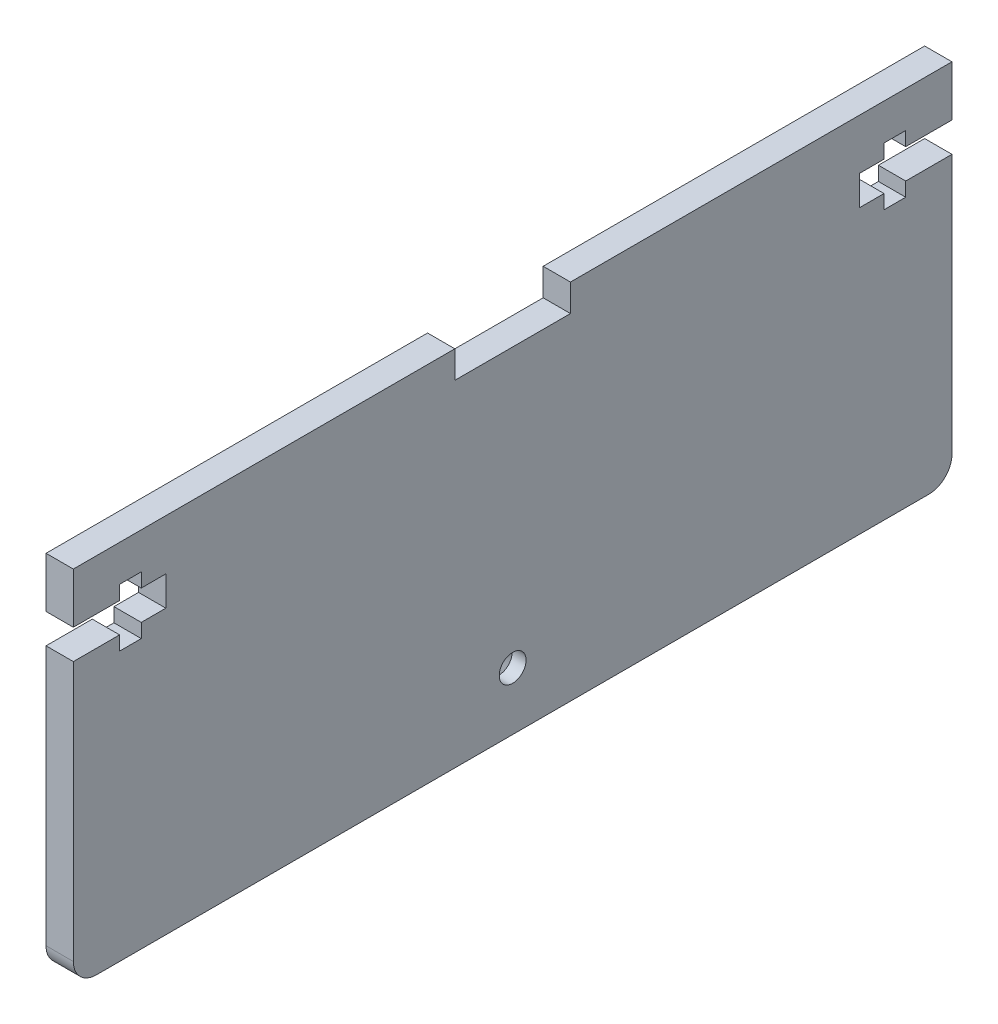
ISO-10303-21;
HEADER;
FILE_DESCRIPTION(('STEP AP214'),'2;1');
FILE_NAME('part.step','',(''),(''),'','','');
FILE_SCHEMA(('AUTOMOTIVE_DESIGN { 1 0 10303 214 1 1 1 1 }'));
ENDSEC;
DATA;
#1=APPLICATION_CONTEXT('core data for automotive mechanical design processes');
#2=APPLICATION_PROTOCOL_DEFINITION('international standard','automotive_design',2000,#1);
#3=PRODUCT_CONTEXT('',#1,'mechanical');
#4=PRODUCT('Part','Part','',(#3));
#5=PRODUCT_RELATED_PRODUCT_CATEGORY('part','',(#4));
#6=PRODUCT_DEFINITION_FORMATION('','',#4);
#7=PRODUCT_DEFINITION_CONTEXT('part definition',#1,'design');
#8=PRODUCT_DEFINITION('design','',#6,#7);
#9=PRODUCT_DEFINITION_SHAPE('','',#8);
#10=(LENGTH_UNIT() NAMED_UNIT(*) SI_UNIT(.MILLI.,.METRE.));
#11=(NAMED_UNIT(*) PLANE_ANGLE_UNIT() SI_UNIT($,.RADIAN.));
#12=(NAMED_UNIT(*) SI_UNIT($,.STERADIAN.) SOLID_ANGLE_UNIT());
#13=UNCERTAINTY_MEASURE_WITH_UNIT(LENGTH_MEASURE(1.E-05),#10,'distance_accuracy_value','');
#14=(GEOMETRIC_REPRESENTATION_CONTEXT(3) GLOBAL_UNCERTAINTY_ASSIGNED_CONTEXT((#13)) GLOBAL_UNIT_ASSIGNED_CONTEXT((#10,
#11,#12)) REPRESENTATION_CONTEXT('',''));
#15=CARTESIAN_POINT('',(0.,0.,0.));
#16=DIRECTION('',(0.,0.,1.));
#17=DIRECTION('',(1.,0.,0.));
#18=AXIS2_PLACEMENT_3D('',#15,#16,#17);
#19=CARTESIAN_POINT('',(3.,39.878,0.));
#20=DIRECTION('',(0.,-1.,0.));
#21=DIRECTION('',(0.,0.,-1.));
#22=AXIS2_PLACEMENT_3D('',#19,#20,#21);
#23=PLANE('',#22);
#24=DIRECTION('',(0.,0.,1.));
#25=VECTOR('',#24,1.);
#26=CARTESIAN_POINT('',(3.,39.878,0.));
#27=LINE('',#26,#25);
#28=CARTESIAN_POINT('',(3.,39.878,-41.91));
#29=VERTEX_POINT('',#28);
#30=CARTESIAN_POINT('',(3.,39.878,0.));
#31=VERTEX_POINT('',#30);
#32=EDGE_CURVE('E490',#29,#31,#27,.T.);
#33=ORIENTED_EDGE('',*,*,#32,.F.);
#34=DIRECTION('',(1.,0.,0.));
#35=VECTOR('',#34,1.);
#36=CARTESIAN_POINT('',(0.,39.878,-41.91));
#37=LINE('',#36,#35);
#38=CARTESIAN_POINT('',(0.,39.878,-41.91));
#39=VERTEX_POINT('',#38);
#40=EDGE_CURVE('E286',#39,#29,#37,.T.);
#41=ORIENTED_EDGE('',*,*,#40,.F.);
#42=DIRECTION('',(0.,0.,1.));
#43=VECTOR('',#42,1.);
#44=CARTESIAN_POINT('',(0.,39.878,0.));
#45=LINE('',#44,#43);
#46=CARTESIAN_POINT('',(0.,39.878,0.));
#47=VERTEX_POINT('',#46);
#48=EDGE_CURVE('E277',#39,#47,#45,.T.);
#49=ORIENTED_EDGE('',*,*,#48,.T.);
#50=DIRECTION('',(-1.,0.,0.));
#51=VECTOR('',#50,1.);
#52=CARTESIAN_POINT('',(3.,39.878,0.));
#53=LINE('',#52,#51);
#54=EDGE_CURVE('E494',#31,#47,#53,.T.);
#55=ORIENTED_EDGE('',*,*,#54,.F.);
#56=EDGE_LOOP('',(#33,#41,#49,#55));
#57=FACE_BOUND('',#56,.T.);
#58=ADVANCED_FACE('F33',(#57),#23,.F.);
#59=CARTESIAN_POINT('',(3.,0.,-96.52));
#60=DIRECTION('',(0.,0.,1.));
#61=DIRECTION('',(1.,0.,0.));
#62=AXIS2_PLACEMENT_3D('',#59,#60,#61);
#63=PLANE('',#62);
#64=DIRECTION('',(0.,1.,0.));
#65=VECTOR('',#64,1.);
#66=CARTESIAN_POINT('',(3.,0.,-96.52));
#67=LINE('',#66,#65);
#68=CARTESIAN_POINT('',(3.,2.54,-96.52));
#69=VERTEX_POINT('',#68);
#70=CARTESIAN_POINT('',(3.,31.0741,-96.52));
#71=VERTEX_POINT('',#70);
#72=EDGE_CURVE('E488',#69,#71,#67,.T.);
#73=ORIENTED_EDGE('',*,*,#72,.F.);
#74=DIRECTION('',(-1.,0.,0.));
#75=VECTOR('',#74,1.);
#76=CARTESIAN_POINT('',(3.,2.54,-96.52));
#77=LINE('',#76,#75);
#78=CARTESIAN_POINT('',(0.,2.54,-96.52));
#79=VERTEX_POINT('',#78);
#80=EDGE_CURVE('E512',#69,#79,#77,.T.);
#81=ORIENTED_EDGE('',*,*,#80,.T.);
#82=DIRECTION('',(0.,1.,0.));
#83=VECTOR('',#82,1.);
#84=CARTESIAN_POINT('',(0.,0.,-96.52));
#85=LINE('',#84,#83);
#86=CARTESIAN_POINT('',(0.,31.0741,-96.52));
#87=VERTEX_POINT('',#86);
#88=EDGE_CURVE('E502',#79,#87,#85,.T.);
#89=ORIENTED_EDGE('',*,*,#88,.T.);
#90=DIRECTION('',(1.,0.,0.));
#91=VECTOR('',#90,1.);
#92=CARTESIAN_POINT('',(0.,31.0741,-96.52));
#93=LINE('',#92,#91);
#94=EDGE_CURVE('E327',#87,#71,#93,.T.);
#95=ORIENTED_EDGE('',*,*,#94,.T.);
#96=EDGE_LOOP('',(#73,#81,#89,#95));
#97=FACE_BOUND('',#96,.T.);
#98=ADVANCED_FACE('F535',(#97),#63,.F.);
#99=CARTESIAN_POINT('',(3.,0.,0.));
#100=DIRECTION('',(0.,0.,-1.));
#101=DIRECTION('',(-1.,0.,0.));
#102=AXIS2_PLACEMENT_3D('',#99,#100,#101);
#103=PLANE('',#102);
#104=DIRECTION('',(0.,-1.,0.));
#105=VECTOR('',#104,1.);
#106=CARTESIAN_POINT('',(0.,0.,0.));
#107=LINE('',#106,#105);
#108=CARTESIAN_POINT('',(0.,34.338,0.));
#109=VERTEX_POINT('',#108);
#110=EDGE_CURVE('E495',#47,#109,#107,.T.);
#111=ORIENTED_EDGE('',*,*,#110,.T.);
#112=DIRECTION('',(1.,0.,0.));
#113=VECTOR('',#112,1.);
#114=CARTESIAN_POINT('',(0.,34.338,0.));
#115=LINE('',#114,#113);
#116=CARTESIAN_POINT('',(3.,34.338,0.));
#117=VERTEX_POINT('',#116);
#118=EDGE_CURVE('E449',#109,#117,#115,.T.);
#119=ORIENTED_EDGE('',*,*,#118,.T.);
#120=DIRECTION('',(0.,-1.,0.));
#121=VECTOR('',#120,1.);
#122=CARTESIAN_POINT('',(3.,0.,0.));
#123=LINE('',#122,#121);
#124=EDGE_CURVE('E480',#31,#117,#123,.T.);
#125=ORIENTED_EDGE('',*,*,#124,.F.);
#126=ORIENTED_EDGE('',*,*,#54,.T.);
#127=EDGE_LOOP('',(#111,#119,#125,#126));
#128=FACE_BOUND('',#127,.T.);
#129=ADVANCED_FACE('F592',(#128),#103,.F.);
#130=CARTESIAN_POINT('',(0.,31.0741,0.));
#131=VERTEX_POINT('',#130);
#132=CARTESIAN_POINT('',(0.,2.54,0.));
#133=VERTEX_POINT('',#132);
#134=EDGE_CURVE('E479',#131,#133,#107,.T.);
#135=ORIENTED_EDGE('',*,*,#134,.T.);
#136=DIRECTION('',(-1.,0.,0.));
#137=VECTOR('',#136,1.);
#138=CARTESIAN_POINT('',(3.,2.54,0.));
#139=LINE('',#138,#137);
#140=CARTESIAN_POINT('',(3.,2.54,0.));
#141=VERTEX_POINT('',#140);
#142=EDGE_CURVE('E11',#133,#141,#139,.F.);
#143=ORIENTED_EDGE('',*,*,#142,.T.);
#144=CARTESIAN_POINT('',(3.,31.0741,0.));
#145=VERTEX_POINT('',#144);
#146=EDGE_CURVE('E484',#145,#141,#123,.T.);
#147=ORIENTED_EDGE('',*,*,#146,.F.);
#148=DIRECTION('',(1.,0.,0.));
#149=VECTOR('',#148,1.);
#150=CARTESIAN_POINT('',(0.,31.0741,0.));
#151=LINE('',#150,#149);
#152=EDGE_CURVE('E418',#131,#145,#151,.T.);
#153=ORIENTED_EDGE('',*,*,#152,.F.);
#154=EDGE_LOOP('',(#135,#143,#147,#153));
#155=FACE_BOUND('',#154,.T.);
#156=ADVANCED_FACE('F547',(#155),#103,.F.);
#157=CARTESIAN_POINT('',(3.,0.,0.));
#158=DIRECTION('',(0.,1.,0.));
#159=DIRECTION('',(0.,0.,1.));
#160=AXIS2_PLACEMENT_3D('',#157,#158,#159);
#161=PLANE('',#160);
#162=DIRECTION('',(0.,0.,-1.));
#163=VECTOR('',#162,1.);
#164=CARTESIAN_POINT('',(0.,0.,0.));
#165=LINE('',#164,#163);
#166=CARTESIAN_POINT('',(0.,0.,-2.54));
#167=VERTEX_POINT('',#166);
#168=CARTESIAN_POINT('',(0.,0.,-93.98));
#169=VERTEX_POINT('',#168);
#170=EDGE_CURVE('E498',#167,#169,#165,.T.);
#171=ORIENTED_EDGE('',*,*,#170,.T.);
#172=DIRECTION('',(-1.,0.,0.));
#173=VECTOR('',#172,1.);
#174=CARTESIAN_POINT('',(3.,0.,-93.98));
#175=LINE('',#174,#173);
#176=CARTESIAN_POINT('',(3.,0.,-93.98));
#177=VERTEX_POINT('',#176);
#178=EDGE_CURVE('E522',#169,#177,#175,.F.);
#179=ORIENTED_EDGE('',*,*,#178,.T.);
#180=DIRECTION('',(0.,0.,-1.));
#181=VECTOR('',#180,1.);
#182=CARTESIAN_POINT('',(3.,0.,0.));
#183=LINE('',#182,#181);
#184=CARTESIAN_POINT('',(3.,0.,-2.54));
#185=VERTEX_POINT('',#184);
#186=EDGE_CURVE('E483',#185,#177,#183,.T.);
#187=ORIENTED_EDGE('',*,*,#186,.F.);
#188=DIRECTION('',(-1.,0.,0.));
#189=VECTOR('',#188,1.);
#190=CARTESIAN_POINT('',(3.,0.,-2.54));
#191=LINE('',#190,#189);
#192=EDGE_CURVE('E519',#185,#167,#191,.T.);
#193=ORIENTED_EDGE('',*,*,#192,.T.);
#194=EDGE_LOOP('',(#171,#179,#187,#193));
#195=FACE_BOUND('',#194,.T.);
#196=ADVANCED_FACE('F541',(#195),#161,.F.);
#197=CARTESIAN_POINT('',(3.,34.338,-96.52));
#198=VERTEX_POINT('',#197);
#199=CARTESIAN_POINT('',(3.,39.878,-96.52));
#200=VERTEX_POINT('',#199);
#201=EDGE_CURVE('E487',#198,#200,#67,.T.);
#202=ORIENTED_EDGE('',*,*,#201,.F.);
#203=DIRECTION('',(1.,0.,0.));
#204=VECTOR('',#203,1.);
#205=CARTESIAN_POINT('',(0.,34.338,-96.52));
#206=LINE('',#205,#204);
#207=CARTESIAN_POINT('',(0.,34.338,-96.52));
#208=VERTEX_POINT('',#207);
#209=EDGE_CURVE('E380',#208,#198,#206,.T.);
#210=ORIENTED_EDGE('',*,*,#209,.F.);
#211=CARTESIAN_POINT('',(0.,39.878,-96.52));
#212=VERTEX_POINT('',#211);
#213=EDGE_CURVE('E501',#208,#212,#85,.T.);
#214=ORIENTED_EDGE('',*,*,#213,.T.);
#215=DIRECTION('',(-1.,0.,0.));
#216=VECTOR('',#215,1.);
#217=CARTESIAN_POINT('',(3.,39.878,-96.52));
#218=LINE('',#217,#216);
#219=EDGE_CURVE('E509',#200,#212,#218,.T.);
#220=ORIENTED_EDGE('',*,*,#219,.F.);
#221=EDGE_LOOP('',(#202,#210,#214,#220));
#222=FACE_BOUND('',#221,.T.);
#223=ADVANCED_FACE('F608',(#222),#63,.F.);
#224=CARTESIAN_POINT('',(0.,39.878,-54.61));
#225=VERTEX_POINT('',#224);
#226=EDGE_CURVE('E504',#212,#225,#45,.T.);
#227=ORIENTED_EDGE('',*,*,#226,.T.);
#228=DIRECTION('',(1.,0.,0.));
#229=VECTOR('',#228,1.);
#230=CARTESIAN_POINT('',(0.,39.878,-54.61));
#231=LINE('',#230,#229);
#232=CARTESIAN_POINT('',(3.,39.878,-54.61));
#233=VERTEX_POINT('',#232);
#234=EDGE_CURVE('E289',#225,#233,#231,.T.);
#235=ORIENTED_EDGE('',*,*,#234,.T.);
#236=EDGE_CURVE('E491',#200,#233,#27,.T.);
#237=ORIENTED_EDGE('',*,*,#236,.F.);
#238=ORIENTED_EDGE('',*,*,#219,.T.);
#239=EDGE_LOOP('',(#227,#235,#237,#238));
#240=FACE_BOUND('',#239,.T.);
#241=ADVANCED_FACE('F601',(#240),#23,.F.);
#242=CARTESIAN_POINT('',(3.,0.,0.));
#243=DIRECTION('',(-1.,0.,0.));
#244=DIRECTION('',(0.,0.,1.));
#245=AXIS2_PLACEMENT_3D('',#242,#243,#244);
#246=PLANE('',#245);
#247=CARTESIAN_POINT('',(3.,6.35,-48.26));
#248=DIRECTION('',(1.,0.,0.));
#249=DIRECTION('',(0.,0.,-1.));
#250=AXIS2_PLACEMENT_3D('',#247,#248,#249);
#251=CIRCLE('',#250,1.47319999999999);
#252=CARTESIAN_POINT('',(3.,6.35,-49.7332));
#253=VERTEX_POINT('',#252);
#254=EDGE_CURVE('E452',#253,#253,#251,.T.);
#255=ORIENTED_EDGE('',*,*,#254,.F.);
#256=EDGE_LOOP('',(#255));
#257=FACE_BOUND('',#256,.T.);
#258=DIRECTION('',(0.,0.,-1.));
#259=VECTOR('',#258,1.);
#260=CARTESIAN_POINT('',(3.,36.878,-41.91));
#261=LINE('',#260,#259);
#262=CARTESIAN_POINT('',(3.,36.878,-41.91));
#263=VERTEX_POINT('',#262);
#264=CARTESIAN_POINT('',(3.,36.878,-54.61));
#265=VERTEX_POINT('',#264);
#266=EDGE_CURVE('E280',#263,#265,#261,.T.);
#267=ORIENTED_EDGE('',*,*,#266,.F.);
#268=DIRECTION('',(0.,-1.,0.));
#269=VECTOR('',#268,1.);
#270=CARTESIAN_POINT('',(3.,39.878,-41.91));
#271=LINE('',#270,#269);
#272=EDGE_CURVE('E263',#29,#263,#271,.T.);
#273=ORIENTED_EDGE('',*,*,#272,.F.);
#274=ORIENTED_EDGE('',*,*,#32,.T.);
#275=ORIENTED_EDGE('',*,*,#124,.T.);
#276=DIRECTION('',(0.,0.,1.));
#277=VECTOR('',#276,1.);
#278=CARTESIAN_POINT('',(3.,34.338,0.));
#279=LINE('',#278,#277);
#280=CARTESIAN_POINT('',(3.,34.338,-5.08));
#281=VERTEX_POINT('',#280);
#282=EDGE_CURVE('E388',#281,#117,#279,.T.);
#283=ORIENTED_EDGE('',*,*,#282,.F.);
#284=DIRECTION('',(0.,-1.,0.));
#285=VECTOR('',#284,1.);
#286=CARTESIAN_POINT('',(3.,34.338,-5.08));
#287=LINE('',#286,#285);
#288=CARTESIAN_POINT('',(3.,35.88105,-5.08));
#289=VERTEX_POINT('',#288);
#290=EDGE_CURVE('E445',#289,#281,#287,.T.);
#291=ORIENTED_EDGE('',*,*,#290,.F.);
#292=DIRECTION('',(0.,0.,1.));
#293=VECTOR('',#292,1.);
#294=CARTESIAN_POINT('',(3.,35.88105,-5.08));
#295=LINE('',#294,#293);
#296=CARTESIAN_POINT('',(3.,35.88105,-7.46125));
#297=VERTEX_POINT('',#296);
#298=EDGE_CURVE('E442',#297,#289,#295,.T.);
#299=ORIENTED_EDGE('',*,*,#298,.F.);
#300=DIRECTION('',(0.,1.,0.));
#301=VECTOR('',#300,1.);
#302=CARTESIAN_POINT('',(3.,35.88105,-7.46125));
#303=LINE('',#302,#301);
#304=CARTESIAN_POINT('',(3.,34.338,-7.46125));
#305=VERTEX_POINT('',#304);
#306=EDGE_CURVE('E439',#305,#297,#303,.T.);
#307=ORIENTED_EDGE('',*,*,#306,.F.);
#308=DIRECTION('',(0.,0.,1.));
#309=VECTOR('',#308,1.);
#310=CARTESIAN_POINT('',(3.,34.338,-7.46125));
#311=LINE('',#310,#309);
#312=CARTESIAN_POINT('',(3.,34.338,-10.16));
#313=VERTEX_POINT('',#312);
#314=EDGE_CURVE('E436',#313,#305,#311,.T.);
#315=ORIENTED_EDGE('',*,*,#314,.F.);
#316=DIRECTION('',(0.,1.,0.));
#317=VECTOR('',#316,1.);
#318=CARTESIAN_POINT('',(3.,34.338,-10.16));
#319=LINE('',#318,#317);
#320=CARTESIAN_POINT('',(3.,31.0741,-10.16));
#321=VERTEX_POINT('',#320);
#322=EDGE_CURVE('E433',#321,#313,#319,.T.);
#323=ORIENTED_EDGE('',*,*,#322,.F.);
#324=DIRECTION('',(0.,0.,-1.));
#325=VECTOR('',#324,1.);
#326=CARTESIAN_POINT('',(3.,31.0741,-10.16));
#327=LINE('',#326,#325);
#328=CARTESIAN_POINT('',(3.,31.0741,-7.46125));
#329=VERTEX_POINT('',#328);
#330=EDGE_CURVE('E430',#329,#321,#327,.T.);
#331=ORIENTED_EDGE('',*,*,#330,.F.);
#332=DIRECTION('',(0.,1.,0.));
#333=VECTOR('',#332,1.);
#334=CARTESIAN_POINT('',(3.,31.0741,-7.46125));
#335=LINE('',#334,#333);
#336=CARTESIAN_POINT('',(3.,29.53105,-7.46125));
#337=VERTEX_POINT('',#336);
#338=EDGE_CURVE('E427',#337,#329,#335,.T.);
#339=ORIENTED_EDGE('',*,*,#338,.F.);
#340=DIRECTION('',(0.,0.,-1.));
#341=VECTOR('',#340,1.);
#342=CARTESIAN_POINT('',(3.,29.53105,-7.46125));
#343=LINE('',#342,#341);
#344=CARTESIAN_POINT('',(3.,29.53105,-5.08));
#345=VERTEX_POINT('',#344);
#346=EDGE_CURVE('E424',#345,#337,#343,.T.);
#347=ORIENTED_EDGE('',*,*,#346,.F.);
#348=DIRECTION('',(0.,-1.,0.));
#349=VECTOR('',#348,1.);
#350=CARTESIAN_POINT('',(3.,29.53105,-5.08));
#351=LINE('',#350,#349);
#352=CARTESIAN_POINT('',(3.,31.0741,-5.08));
#353=VERTEX_POINT('',#352);
#354=EDGE_CURVE('E421',#353,#345,#351,.T.);
#355=ORIENTED_EDGE('',*,*,#354,.F.);
#356=DIRECTION('',(0.,0.,-1.));
#357=VECTOR('',#356,1.);
#358=CARTESIAN_POINT('',(3.,31.0741,-5.08));
#359=LINE('',#358,#357);
#360=EDGE_CURVE('E361',#145,#353,#359,.T.);
#361=ORIENTED_EDGE('',*,*,#360,.F.);
#362=ORIENTED_EDGE('',*,*,#146,.T.);
#363=CARTESIAN_POINT('',(3.,2.54,-2.54));
#364=DIRECTION('',(-1.,0.,0.));
#365=DIRECTION('',(0.,0.,1.));
#366=AXIS2_PLACEMENT_3D('',#363,#364,#365);
#367=CIRCLE('',#366,2.54);
#368=EDGE_CURVE('E524',#141,#185,#367,.F.);
#369=ORIENTED_EDGE('',*,*,#368,.T.);
#370=ORIENTED_EDGE('',*,*,#186,.T.);
#371=CARTESIAN_POINT('',(3.,2.54,-93.98));
#372=DIRECTION('',(-1.,0.,0.));
#373=DIRECTION('',(0.,0.,1.));
#374=AXIS2_PLACEMENT_3D('',#371,#372,#373);
#375=CIRCLE('',#374,2.54);
#376=EDGE_CURVE('E41',#177,#69,#375,.F.);
#377=ORIENTED_EDGE('',*,*,#376,.T.);
#378=ORIENTED_EDGE('',*,*,#72,.T.);
#379=DIRECTION('',(0.,0.,-1.));
#380=VECTOR('',#379,1.);
#381=CARTESIAN_POINT('',(3.,31.0741,-91.44));
#382=LINE('',#381,#380);
#383=CARTESIAN_POINT('',(3.,31.0741,-91.44));
#384=VERTEX_POINT('',#383);
#385=EDGE_CURVE('E288',#384,#71,#382,.T.);
#386=ORIENTED_EDGE('',*,*,#385,.F.);
#387=DIRECTION('',(0.,1.,0.));
#388=VECTOR('',#387,1.);
#389=CARTESIAN_POINT('',(3.,29.53105,-91.44));
#390=LINE('',#389,#388);
#391=CARTESIAN_POINT('',(3.,29.53105,-91.44));
#392=VERTEX_POINT('',#391);
#393=EDGE_CURVE('E297',#392,#384,#390,.T.);
#394=ORIENTED_EDGE('',*,*,#393,.F.);
#395=DIRECTION('',(0.,0.,-1.));
#396=VECTOR('',#395,1.);
#397=CARTESIAN_POINT('',(3.,29.53105,-89.05875));
#398=LINE('',#397,#396);
#399=CARTESIAN_POINT('',(3.,29.53105,-89.05875));
#400=VERTEX_POINT('',#399);
#401=EDGE_CURVE('E354',#400,#392,#398,.T.);
#402=ORIENTED_EDGE('',*,*,#401,.F.);
#403=DIRECTION('',(0.,-1.,0.));
#404=VECTOR('',#403,1.);
#405=CARTESIAN_POINT('',(3.,31.0741,-89.05875));
#406=LINE('',#405,#404);
#407=CARTESIAN_POINT('',(3.,31.0741,-89.05875));
#408=VERTEX_POINT('',#407);
#409=EDGE_CURVE('E351',#408,#400,#406,.T.);
#410=ORIENTED_EDGE('',*,*,#409,.F.);
#411=DIRECTION('',(0.,0.,-1.));
#412=VECTOR('',#411,1.);
#413=CARTESIAN_POINT('',(3.,31.0741,-86.36));
#414=LINE('',#413,#412);
#415=CARTESIAN_POINT('',(3.,31.0741,-86.36));
#416=VERTEX_POINT('',#415);
#417=EDGE_CURVE('E348',#416,#408,#414,.T.);
#418=ORIENTED_EDGE('',*,*,#417,.F.);
#419=DIRECTION('',(0.,-1.,0.));
#420=VECTOR('',#419,1.);
#421=CARTESIAN_POINT('',(3.,34.338,-86.36));
#422=LINE('',#421,#420);
#423=CARTESIAN_POINT('',(3.,34.338,-86.36));
#424=VERTEX_POINT('',#423);
#425=EDGE_CURVE('E345',#424,#416,#422,.T.);
#426=ORIENTED_EDGE('',*,*,#425,.F.);
#427=DIRECTION('',(0.,0.,1.));
#428=VECTOR('',#427,1.);
#429=CARTESIAN_POINT('',(3.,34.338,-89.05875));
#430=LINE('',#429,#428);
#431=CARTESIAN_POINT('',(3.,34.338,-89.05875));
#432=VERTEX_POINT('',#431);
#433=EDGE_CURVE('E342',#432,#424,#430,.T.);
#434=ORIENTED_EDGE('',*,*,#433,.F.);
#435=DIRECTION('',(0.,-1.,0.));
#436=VECTOR('',#435,1.);
#437=CARTESIAN_POINT('',(3.,35.88105,-89.05875));
#438=LINE('',#437,#436);
#439=CARTESIAN_POINT('',(3.,35.88105,-89.05875));
#440=VERTEX_POINT('',#439);
#441=EDGE_CURVE('E339',#440,#432,#438,.T.);
#442=ORIENTED_EDGE('',*,*,#441,.F.);
#443=DIRECTION('',(0.,0.,1.));
#444=VECTOR('',#443,1.);
#445=CARTESIAN_POINT('',(3.,35.88105,-91.44));
#446=LINE('',#445,#444);
#447=CARTESIAN_POINT('',(3.,35.88105,-91.44));
#448=VERTEX_POINT('',#447);
#449=EDGE_CURVE('E336',#448,#440,#446,.T.);
#450=ORIENTED_EDGE('',*,*,#449,.F.);
#451=DIRECTION('',(0.,1.,0.));
#452=VECTOR('',#451,1.);
#453=CARTESIAN_POINT('',(3.,34.338,-91.44));
#454=LINE('',#453,#452);
#455=CARTESIAN_POINT('',(3.,34.338,-91.44));
#456=VERTEX_POINT('',#455);
#457=EDGE_CURVE('E333',#456,#448,#454,.T.);
#458=ORIENTED_EDGE('',*,*,#457,.F.);
#459=DIRECTION('',(0.,0.,1.));
#460=VECTOR('',#459,1.);
#461=CARTESIAN_POINT('',(3.,34.338,-96.52));
#462=LINE('',#461,#460);
#463=EDGE_CURVE('E330',#198,#456,#462,.T.);
#464=ORIENTED_EDGE('',*,*,#463,.F.);
#465=ORIENTED_EDGE('',*,*,#201,.T.);
#466=ORIENTED_EDGE('',*,*,#236,.T.);
#467=DIRECTION('',(0.,1.,0.));
#468=VECTOR('',#467,1.);
#469=CARTESIAN_POINT('',(3.,39.878,-54.61));
#470=LINE('',#469,#468);
#471=EDGE_CURVE('E278',#265,#233,#470,.T.);
#472=ORIENTED_EDGE('',*,*,#471,.F.);
#473=EDGE_LOOP('',(#267,#273,#274,#275,#283,#291,#299,#307,#315,#323,#331,#339,#347,#355,#361,
#362,#369,#370,#377,#378,#386,#394,#402,#410,#418,#426,#434,#442,#450,#458,#464,#465,#466,#472));
#474=FACE_BOUND('',#473,.T.);
#475=ADVANCED_FACE('F528',(#257,#474),#246,.F.);
#476=CARTESIAN_POINT('',(0.,0.,0.));
#477=DIRECTION('',(-1.,0.,0.));
#478=DIRECTION('',(0.,0.,1.));
#479=AXIS2_PLACEMENT_3D('',#476,#477,#478);
#480=PLANE('',#479);
#481=DIRECTION('',(0.,-1.,0.));
#482=VECTOR('',#481,1.);
#483=CARTESIAN_POINT('',(0.,39.878,-41.91));
#484=LINE('',#483,#482);
#485=CARTESIAN_POINT('',(0.,36.878,-41.91));
#486=VERTEX_POINT('',#485);
#487=EDGE_CURVE('E260',#39,#486,#484,.T.);
#488=ORIENTED_EDGE('',*,*,#487,.T.);
#489=DIRECTION('',(0.,0.,-1.));
#490=VECTOR('',#489,1.);
#491=CARTESIAN_POINT('',(0.,36.878,-41.91));
#492=LINE('',#491,#490);
#493=CARTESIAN_POINT('',(0.,36.878,-54.61));
#494=VERTEX_POINT('',#493);
#495=EDGE_CURVE('E270',#486,#494,#492,.T.);
#496=ORIENTED_EDGE('',*,*,#495,.T.);
#497=DIRECTION('',(0.,1.,0.));
#498=VECTOR('',#497,1.);
#499=CARTESIAN_POINT('',(0.,39.878,-54.61));
#500=LINE('',#499,#498);
#501=EDGE_CURVE('E48',#494,#225,#500,.T.);
#502=ORIENTED_EDGE('',*,*,#501,.T.);
#503=ORIENTED_EDGE('',*,*,#226,.F.);
#504=ORIENTED_EDGE('',*,*,#213,.F.);
#505=DIRECTION('',(0.,0.,1.));
#506=VECTOR('',#505,1.);
#507=CARTESIAN_POINT('',(0.,34.338,-96.52));
#508=LINE('',#507,#506);
#509=CARTESIAN_POINT('',(0.,34.338,-91.44));
#510=VERTEX_POINT('',#509);
#511=EDGE_CURVE('E296',#208,#510,#508,.T.);
#512=ORIENTED_EDGE('',*,*,#511,.T.);
#513=DIRECTION('',(0.,1.,0.));
#514=VECTOR('',#513,1.);
#515=CARTESIAN_POINT('',(0.,34.338,-91.44));
#516=LINE('',#515,#514);
#517=CARTESIAN_POINT('',(0.,35.88105,-91.44));
#518=VERTEX_POINT('',#517);
#519=EDGE_CURVE('E300',#510,#518,#516,.T.);
#520=ORIENTED_EDGE('',*,*,#519,.T.);
#521=DIRECTION('',(0.,0.,1.));
#522=VECTOR('',#521,1.);
#523=CARTESIAN_POINT('',(0.,35.88105,-91.44));
#524=LINE('',#523,#522);
#525=CARTESIAN_POINT('',(0.,35.88105,-89.05875));
#526=VERTEX_POINT('',#525);
#527=EDGE_CURVE('E303',#518,#526,#524,.T.);
#528=ORIENTED_EDGE('',*,*,#527,.T.);
#529=DIRECTION('',(0.,-1.,0.));
#530=VECTOR('',#529,1.);
#531=CARTESIAN_POINT('',(0.,35.88105,-89.05875));
#532=LINE('',#531,#530);
#533=CARTESIAN_POINT('',(0.,34.338,-89.05875));
#534=VERTEX_POINT('',#533);
#535=EDGE_CURVE('E306',#526,#534,#532,.T.);
#536=ORIENTED_EDGE('',*,*,#535,.T.);
#537=DIRECTION('',(0.,0.,1.));
#538=VECTOR('',#537,1.);
#539=CARTESIAN_POINT('',(0.,34.338,-89.05875));
#540=LINE('',#539,#538);
#541=CARTESIAN_POINT('',(0.,34.338,-86.36));
#542=VERTEX_POINT('',#541);
#543=EDGE_CURVE('E309',#534,#542,#540,.T.);
#544=ORIENTED_EDGE('',*,*,#543,.T.);
#545=DIRECTION('',(0.,-1.,0.));
#546=VECTOR('',#545,1.);
#547=CARTESIAN_POINT('',(0.,34.338,-86.36));
#548=LINE('',#547,#546);
#549=CARTESIAN_POINT('',(0.,31.0741,-86.36));
#550=VERTEX_POINT('',#549);
#551=EDGE_CURVE('E312',#542,#550,#548,.T.);
#552=ORIENTED_EDGE('',*,*,#551,.T.);
#553=DIRECTION('',(0.,0.,-1.));
#554=VECTOR('',#553,1.);
#555=CARTESIAN_POINT('',(0.,31.0741,-86.36));
#556=LINE('',#555,#554);
#557=CARTESIAN_POINT('',(0.,31.0741,-89.05875));
#558=VERTEX_POINT('',#557);
#559=EDGE_CURVE('E315',#550,#558,#556,.T.);
#560=ORIENTED_EDGE('',*,*,#559,.T.);
#561=DIRECTION('',(0.,-1.,0.));
#562=VECTOR('',#561,1.);
#563=CARTESIAN_POINT('',(0.,31.0741,-89.05875));
#564=LINE('',#563,#562);
#565=CARTESIAN_POINT('',(0.,29.53105,-89.05875));
#566=VERTEX_POINT('',#565);
#567=EDGE_CURVE('E318',#558,#566,#564,.T.);
#568=ORIENTED_EDGE('',*,*,#567,.T.);
#569=DIRECTION('',(0.,0.,-1.));
#570=VECTOR('',#569,1.);
#571=CARTESIAN_POINT('',(0.,29.53105,-89.05875));
#572=LINE('',#571,#570);
#573=CARTESIAN_POINT('',(0.,29.53105,-91.44));
#574=VERTEX_POINT('',#573);
#575=EDGE_CURVE('E321',#566,#574,#572,.T.);
#576=ORIENTED_EDGE('',*,*,#575,.T.);
#577=DIRECTION('',(0.,1.,0.));
#578=VECTOR('',#577,1.);
#579=CARTESIAN_POINT('',(0.,29.53105,-91.44));
#580=LINE('',#579,#578);
#581=CARTESIAN_POINT('',(0.,31.0741,-91.44));
#582=VERTEX_POINT('',#581);
#583=EDGE_CURVE('E324',#574,#582,#580,.T.);
#584=ORIENTED_EDGE('',*,*,#583,.T.);
#585=DIRECTION('',(0.,0.,-1.));
#586=VECTOR('',#585,1.);
#587=CARTESIAN_POINT('',(0.,31.0741,-91.44));
#588=LINE('',#587,#586);
#589=EDGE_CURVE('E293',#582,#87,#588,.T.);
#590=ORIENTED_EDGE('',*,*,#589,.T.);
#591=ORIENTED_EDGE('',*,*,#88,.F.);
#592=CARTESIAN_POINT('',(0.,2.54,-93.98));
#593=DIRECTION('',(-1.,0.,0.));
#594=DIRECTION('',(0.,0.,1.));
#595=AXIS2_PLACEMENT_3D('',#592,#593,#594);
#596=CIRCLE('',#595,2.54);
#597=EDGE_CURVE('E517',#79,#169,#596,.T.);
#598=ORIENTED_EDGE('',*,*,#597,.T.);
#599=ORIENTED_EDGE('',*,*,#170,.F.);
#600=CARTESIAN_POINT('',(0.,2.54,-2.54));
#601=DIRECTION('',(-1.,0.,0.));
#602=DIRECTION('',(0.,0.,1.));
#603=AXIS2_PLACEMENT_3D('',#600,#601,#602);
#604=CIRCLE('',#603,2.54);
#605=EDGE_CURVE('E515',#167,#133,#604,.T.);
#606=ORIENTED_EDGE('',*,*,#605,.T.);
#607=ORIENTED_EDGE('',*,*,#134,.F.);
#608=DIRECTION('',(0.,0.,-1.));
#609=VECTOR('',#608,1.);
#610=CARTESIAN_POINT('',(0.,31.0741,-5.08));
#611=LINE('',#610,#609);
#612=CARTESIAN_POINT('',(0.,31.0741,-5.08));
#613=VERTEX_POINT('',#612);
#614=EDGE_CURVE('E384',#131,#613,#611,.T.);
#615=ORIENTED_EDGE('',*,*,#614,.T.);
#616=DIRECTION('',(0.,-1.,0.));
#617=VECTOR('',#616,1.);
#618=CARTESIAN_POINT('',(0.,29.53105,-5.08));
#619=LINE('',#618,#617);
#620=CARTESIAN_POINT('',(0.,29.53105,-5.08));
#621=VERTEX_POINT('',#620);
#622=EDGE_CURVE('E387',#613,#621,#619,.T.);
#623=ORIENTED_EDGE('',*,*,#622,.T.);
#624=DIRECTION('',(0.,0.,-1.));
#625=VECTOR('',#624,1.);
#626=CARTESIAN_POINT('',(0.,29.53105,-7.46125));
#627=LINE('',#626,#625);
#628=CARTESIAN_POINT('',(0.,29.53105,-7.46125));
#629=VERTEX_POINT('',#628);
#630=EDGE_CURVE('E391',#621,#629,#627,.T.);
#631=ORIENTED_EDGE('',*,*,#630,.T.);
#632=DIRECTION('',(0.,1.,0.));
#633=VECTOR('',#632,1.);
#634=CARTESIAN_POINT('',(0.,31.0741,-7.46125));
#635=LINE('',#634,#633);
#636=CARTESIAN_POINT('',(0.,31.0741,-7.46125));
#637=VERTEX_POINT('',#636);
#638=EDGE_CURVE('E394',#629,#637,#635,.T.);
#639=ORIENTED_EDGE('',*,*,#638,.T.);
#640=DIRECTION('',(0.,0.,-1.));
#641=VECTOR('',#640,1.);
#642=CARTESIAN_POINT('',(0.,31.0741,-10.16));
#643=LINE('',#642,#641);
#644=CARTESIAN_POINT('',(0.,31.0741,-10.16));
#645=VERTEX_POINT('',#644);
#646=EDGE_CURVE('E397',#637,#645,#643,.T.);
#647=ORIENTED_EDGE('',*,*,#646,.T.);
#648=DIRECTION('',(0.,1.,0.));
#649=VECTOR('',#648,1.);
#650=CARTESIAN_POINT('',(0.,34.338,-10.16));
#651=LINE('',#650,#649);
#652=CARTESIAN_POINT('',(0.,34.338,-10.16));
#653=VERTEX_POINT('',#652);
#654=EDGE_CURVE('E400',#645,#653,#651,.T.);
#655=ORIENTED_EDGE('',*,*,#654,.T.);
#656=DIRECTION('',(0.,0.,1.));
#657=VECTOR('',#656,1.);
#658=CARTESIAN_POINT('',(0.,34.338,-7.46125));
#659=LINE('',#658,#657);
#660=CARTESIAN_POINT('',(0.,34.338,-7.46125));
#661=VERTEX_POINT('',#660);
#662=EDGE_CURVE('E403',#653,#661,#659,.T.);
#663=ORIENTED_EDGE('',*,*,#662,.T.);
#664=DIRECTION('',(0.,1.,0.));
#665=VECTOR('',#664,1.);
#666=CARTESIAN_POINT('',(0.,35.88105,-7.46125));
#667=LINE('',#666,#665);
#668=CARTESIAN_POINT('',(0.,35.88105,-7.46125));
#669=VERTEX_POINT('',#668);
#670=EDGE_CURVE('E406',#661,#669,#667,.T.);
#671=ORIENTED_EDGE('',*,*,#670,.T.);
#672=DIRECTION('',(0.,0.,1.));
#673=VECTOR('',#672,1.);
#674=CARTESIAN_POINT('',(0.,35.88105,-5.08));
#675=LINE('',#674,#673);
#676=CARTESIAN_POINT('',(0.,35.88105,-5.08));
#677=VERTEX_POINT('',#676);
#678=EDGE_CURVE('E409',#669,#677,#675,.T.);
#679=ORIENTED_EDGE('',*,*,#678,.T.);
#680=DIRECTION('',(0.,-1.,0.));
#681=VECTOR('',#680,1.);
#682=CARTESIAN_POINT('',(0.,34.338,-5.08));
#683=LINE('',#682,#681);
#684=CARTESIAN_POINT('',(0.,34.338,-5.08));
#685=VERTEX_POINT('',#684);
#686=EDGE_CURVE('E412',#677,#685,#683,.T.);
#687=ORIENTED_EDGE('',*,*,#686,.T.);
#688=DIRECTION('',(0.,0.,1.));
#689=VECTOR('',#688,1.);
#690=CARTESIAN_POINT('',(0.,34.338,0.));
#691=LINE('',#690,#689);
#692=EDGE_CURVE('E415',#685,#109,#691,.T.);
#693=ORIENTED_EDGE('',*,*,#692,.T.);
#694=ORIENTED_EDGE('',*,*,#110,.F.);
#695=ORIENTED_EDGE('',*,*,#48,.F.);
#696=EDGE_LOOP('',(#488,#496,#502,#503,#504,#512,#520,#528,#536,#544,#552,#560,#568,#576,#584,
#590,#591,#598,#599,#606,#607,#615,#623,#631,#639,#647,#655,#663,#671,#679,#687,#693,#694,#695));
#697=FACE_BOUND('',#696,.T.);
#698=ADVANCED_FACE('F275',(#697),#480,.T.);
#699=CARTESIAN_POINT('',(1.476,6.35,-48.26));
#700=DIRECTION('',(1.,0.,0.));
#701=DIRECTION('',(0.,0.,-1.));
#702=AXIS2_PLACEMENT_3D('',#699,#700,#701);
#703=CONICAL_SURFACE('',#702,1.47319999999999,1.02974425867665);
#704=CARTESIAN_POINT('',(0.590812136048598,6.35,-48.26));
#705=VERTEX_POINT('',#704);
#706=VERTEX_LOOP('',#705);
#707=FACE_BOUND('',#706,.T.);
#708=CARTESIAN_POINT('',(1.476,6.35,-48.26));
#709=DIRECTION('',(1.,0.,0.));
#710=DIRECTION('',(0.,0.,-1.));
#711=AXIS2_PLACEMENT_3D('',#708,#709,#710);
#712=CIRCLE('',#711,1.47319999999999);
#713=CARTESIAN_POINT('',(1.476,6.35,-49.7332));
#714=VERTEX_POINT('',#713);
#715=EDGE_CURVE('E476',#714,#714,#712,.T.);
#716=ORIENTED_EDGE('',*,*,#715,.T.);
#717=EDGE_LOOP('',(#716));
#718=FACE_BOUND('',#717,.T.);
#719=ADVANCED_FACE('F889',(#707,#718),#703,.F.);
#720=CARTESIAN_POINT('',(3.,6.35,-48.26));
#721=DIRECTION('',(1.,0.,0.));
#722=DIRECTION('',(0.,0.,-1.));
#723=AXIS2_PLACEMENT_3D('',#720,#721,#722);
#724=CYLINDRICAL_SURFACE('',#723,1.47319999999999);
#725=ORIENTED_EDGE('',*,*,#715,.F.);
#726=EDGE_LOOP('',(#725));
#727=FACE_BOUND('',#726,.T.);
#728=ORIENTED_EDGE('',*,*,#254,.T.);
#729=EDGE_LOOP('',(#728));
#730=FACE_BOUND('',#729,.T.);
#731=ADVANCED_FACE('F870',(#727,#730),#724,.F.);
#732=CARTESIAN_POINT('',(0.,34.338,0.));
#733=DIRECTION('',(0.,1.,0.));
#734=DIRECTION('',(0.,0.,1.));
#735=AXIS2_PLACEMENT_3D('',#732,#733,#734);
#736=PLANE('',#735);
#737=ORIENTED_EDGE('',*,*,#282,.T.);
#738=ORIENTED_EDGE('',*,*,#118,.F.);
#739=ORIENTED_EDGE('',*,*,#692,.F.);
#740=DIRECTION('',(1.,0.,0.));
#741=VECTOR('',#740,1.);
#742=CARTESIAN_POINT('',(0.,34.338,-5.08));
#743=LINE('',#742,#741);
#744=EDGE_CURVE('E453',#685,#281,#743,.T.);
#745=ORIENTED_EDGE('',*,*,#744,.T.);
#746=EDGE_LOOP('',(#737,#738,#739,#745));
#747=FACE_BOUND('',#746,.T.);
#748=ADVANCED_FACE('F590',(#747),#736,.F.);
#749=CARTESIAN_POINT('',(0.,34.338,-5.08));
#750=DIRECTION('',(0.,0.,1.));
#751=DIRECTION('',(1.,0.,0.));
#752=AXIS2_PLACEMENT_3D('',#749,#750,#751);
#753=PLANE('',#752);
#754=ORIENTED_EDGE('',*,*,#290,.T.);
#755=ORIENTED_EDGE('',*,*,#744,.F.);
#756=ORIENTED_EDGE('',*,*,#686,.F.);
#757=DIRECTION('',(1.,0.,0.));
#758=VECTOR('',#757,1.);
#759=CARTESIAN_POINT('',(0.,35.88105,-5.08));
#760=LINE('',#759,#758);
#761=EDGE_CURVE('E455',#677,#289,#760,.T.);
#762=ORIENTED_EDGE('',*,*,#761,.T.);
#763=EDGE_LOOP('',(#754,#755,#756,#762));
#764=FACE_BOUND('',#763,.T.);
#765=ADVANCED_FACE('F586',(#764),#753,.F.);
#766=CARTESIAN_POINT('',(0.,35.88105,-5.08));
#767=DIRECTION('',(0.,1.,0.));
#768=DIRECTION('',(0.,0.,1.));
#769=AXIS2_PLACEMENT_3D('',#766,#767,#768);
#770=PLANE('',#769);
#771=ORIENTED_EDGE('',*,*,#298,.T.);
#772=ORIENTED_EDGE('',*,*,#761,.F.);
#773=ORIENTED_EDGE('',*,*,#678,.F.);
#774=DIRECTION('',(1.,0.,0.));
#775=VECTOR('',#774,1.);
#776=CARTESIAN_POINT('',(0.,35.88105,-7.46125));
#777=LINE('',#776,#775);
#778=EDGE_CURVE('E457',#669,#297,#777,.T.);
#779=ORIENTED_EDGE('',*,*,#778,.T.);
#780=EDGE_LOOP('',(#771,#772,#773,#779));
#781=FACE_BOUND('',#780,.T.);
#782=ADVANCED_FACE('F582',(#781),#770,.F.);
#783=CARTESIAN_POINT('',(0.,35.88105,-7.46125));
#784=DIRECTION('',(0.,0.,-1.));
#785=DIRECTION('',(-1.,0.,0.));
#786=AXIS2_PLACEMENT_3D('',#783,#784,#785);
#787=PLANE('',#786);
#788=ORIENTED_EDGE('',*,*,#306,.T.);
#789=ORIENTED_EDGE('',*,*,#778,.F.);
#790=ORIENTED_EDGE('',*,*,#670,.F.);
#791=DIRECTION('',(1.,0.,0.));
#792=VECTOR('',#791,1.);
#793=CARTESIAN_POINT('',(0.,34.338,-7.46125));
#794=LINE('',#793,#792);
#795=EDGE_CURVE('E459',#661,#305,#794,.T.);
#796=ORIENTED_EDGE('',*,*,#795,.T.);
#797=EDGE_LOOP('',(#788,#789,#790,#796));
#798=FACE_BOUND('',#797,.T.);
#799=ADVANCED_FACE('F578',(#798),#787,.F.);
#800=CARTESIAN_POINT('',(0.,34.338,-7.46125));
#801=DIRECTION('',(0.,1.,0.));
#802=DIRECTION('',(0.,0.,1.));
#803=AXIS2_PLACEMENT_3D('',#800,#801,#802);
#804=PLANE('',#803);
#805=ORIENTED_EDGE('',*,*,#314,.T.);
#806=ORIENTED_EDGE('',*,*,#795,.F.);
#807=ORIENTED_EDGE('',*,*,#662,.F.);
#808=DIRECTION('',(1.,0.,0.));
#809=VECTOR('',#808,1.);
#810=CARTESIAN_POINT('',(0.,34.338,-10.16));
#811=LINE('',#810,#809);
#812=EDGE_CURVE('E461',#653,#313,#811,.T.);
#813=ORIENTED_EDGE('',*,*,#812,.T.);
#814=EDGE_LOOP('',(#805,#806,#807,#813));
#815=FACE_BOUND('',#814,.T.);
#816=ADVANCED_FACE('F574',(#815),#804,.F.);
#817=CARTESIAN_POINT('',(0.,34.338,-10.16));
#818=DIRECTION('',(0.,0.,-1.));
#819=DIRECTION('',(-1.,0.,0.));
#820=AXIS2_PLACEMENT_3D('',#817,#818,#819);
#821=PLANE('',#820);
#822=ORIENTED_EDGE('',*,*,#322,.T.);
#823=ORIENTED_EDGE('',*,*,#812,.F.);
#824=ORIENTED_EDGE('',*,*,#654,.F.);
#825=DIRECTION('',(1.,0.,0.));
#826=VECTOR('',#825,1.);
#827=CARTESIAN_POINT('',(0.,31.0741,-10.16));
#828=LINE('',#827,#826);
#829=EDGE_CURVE('E463',#645,#321,#828,.T.);
#830=ORIENTED_EDGE('',*,*,#829,.T.);
#831=EDGE_LOOP('',(#822,#823,#824,#830));
#832=FACE_BOUND('',#831,.T.);
#833=ADVANCED_FACE('F570',(#832),#821,.F.);
#834=CARTESIAN_POINT('',(0.,31.0741,-10.16));
#835=DIRECTION('',(0.,-1.,0.));
#836=DIRECTION('',(0.,0.,-1.));
#837=AXIS2_PLACEMENT_3D('',#834,#835,#836);
#838=PLANE('',#837);
#839=ORIENTED_EDGE('',*,*,#330,.T.);
#840=ORIENTED_EDGE('',*,*,#829,.F.);
#841=ORIENTED_EDGE('',*,*,#646,.F.);
#842=DIRECTION('',(1.,0.,0.));
#843=VECTOR('',#842,1.);
#844=CARTESIAN_POINT('',(0.,31.0741,-7.46125));
#845=LINE('',#844,#843);
#846=EDGE_CURVE('E465',#637,#329,#845,.T.);
#847=ORIENTED_EDGE('',*,*,#846,.T.);
#848=EDGE_LOOP('',(#839,#840,#841,#847));
#849=FACE_BOUND('',#848,.T.);
#850=ADVANCED_FACE('F566',(#849),#838,.F.);
#851=CARTESIAN_POINT('',(0.,31.0741,-7.46125));
#852=DIRECTION('',(0.,0.,-1.));
#853=DIRECTION('',(-1.,0.,0.));
#854=AXIS2_PLACEMENT_3D('',#851,#852,#853);
#855=PLANE('',#854);
#856=ORIENTED_EDGE('',*,*,#338,.T.);
#857=ORIENTED_EDGE('',*,*,#846,.F.);
#858=ORIENTED_EDGE('',*,*,#638,.F.);
#859=DIRECTION('',(1.,0.,0.));
#860=VECTOR('',#859,1.);
#861=CARTESIAN_POINT('',(0.,29.53105,-7.46125));
#862=LINE('',#861,#860);
#863=EDGE_CURVE('E467',#629,#337,#862,.T.);
#864=ORIENTED_EDGE('',*,*,#863,.T.);
#865=EDGE_LOOP('',(#856,#857,#858,#864));
#866=FACE_BOUND('',#865,.T.);
#867=ADVANCED_FACE('F562',(#866),#855,.F.);
#868=CARTESIAN_POINT('',(0.,29.53105,-7.46125));
#869=DIRECTION('',(0.,-1.,0.));
#870=DIRECTION('',(0.,0.,-1.));
#871=AXIS2_PLACEMENT_3D('',#868,#869,#870);
#872=PLANE('',#871);
#873=ORIENTED_EDGE('',*,*,#346,.T.);
#874=ORIENTED_EDGE('',*,*,#863,.F.);
#875=ORIENTED_EDGE('',*,*,#630,.F.);
#876=DIRECTION('',(1.,0.,0.));
#877=VECTOR('',#876,1.);
#878=CARTESIAN_POINT('',(0.,29.53105,-5.08));
#879=LINE('',#878,#877);
#880=EDGE_CURVE('E469',#621,#345,#879,.T.);
#881=ORIENTED_EDGE('',*,*,#880,.T.);
#882=EDGE_LOOP('',(#873,#874,#875,#881));
#883=FACE_BOUND('',#882,.T.);
#884=ADVANCED_FACE('F560',(#883),#872,.F.);
#885=CARTESIAN_POINT('',(0.,29.53105,-5.08));
#886=DIRECTION('',(0.,0.,1.));
#887=DIRECTION('',(0.,-1.,0.));
#888=AXIS2_PLACEMENT_3D('',#885,#886,#887);
#889=PLANE('',#888);
#890=ORIENTED_EDGE('',*,*,#354,.T.);
#891=ORIENTED_EDGE('',*,*,#880,.F.);
#892=ORIENTED_EDGE('',*,*,#622,.F.);
#893=DIRECTION('',(1.,0.,0.));
#894=VECTOR('',#893,1.);
#895=CARTESIAN_POINT('',(0.,31.0741,-5.08));
#896=LINE('',#895,#894);
#897=EDGE_CURVE('E471',#613,#353,#896,.T.);
#898=ORIENTED_EDGE('',*,*,#897,.T.);
#899=EDGE_LOOP('',(#890,#891,#892,#898));
#900=FACE_BOUND('',#899,.T.);
#901=ADVANCED_FACE('F556',(#900),#889,.F.);
#902=CARTESIAN_POINT('',(0.,31.0741,-5.08));
#903=DIRECTION('',(0.,-1.,0.));
#904=DIRECTION('',(0.,0.,-1.));
#905=AXIS2_PLACEMENT_3D('',#902,#903,#904);
#906=PLANE('',#905);
#907=ORIENTED_EDGE('',*,*,#360,.T.);
#908=ORIENTED_EDGE('',*,*,#897,.F.);
#909=ORIENTED_EDGE('',*,*,#614,.F.);
#910=ORIENTED_EDGE('',*,*,#152,.T.);
#911=EDGE_LOOP('',(#907,#908,#909,#910));
#912=FACE_BOUND('',#911,.T.);
#913=ADVANCED_FACE('F550',(#912),#906,.F.);
#914=CARTESIAN_POINT('',(0.,31.0741,-91.44));
#915=DIRECTION('',(0.,-1.,0.));
#916=DIRECTION('',(0.,0.,-1.));
#917=AXIS2_PLACEMENT_3D('',#914,#915,#916);
#918=PLANE('',#917);
#919=ORIENTED_EDGE('',*,*,#385,.T.);
#920=ORIENTED_EDGE('',*,*,#94,.F.);
#921=ORIENTED_EDGE('',*,*,#589,.F.);
#922=DIRECTION('',(1.,0.,0.));
#923=VECTOR('',#922,1.);
#924=CARTESIAN_POINT('',(0.,31.0741,-91.44));
#925=LINE('',#924,#923);
#926=EDGE_CURVE('E359',#582,#384,#925,.T.);
#927=ORIENTED_EDGE('',*,*,#926,.T.);
#928=EDGE_LOOP('',(#919,#920,#921,#927));
#929=FACE_BOUND('',#928,.T.);
#930=ADVANCED_FACE('F650',(#929),#918,.F.);
#931=CARTESIAN_POINT('',(0.,29.53105,-91.44));
#932=DIRECTION('',(0.,0.,-1.));
#933=DIRECTION('',(-1.,0.,0.));
#934=AXIS2_PLACEMENT_3D('',#931,#932,#933);
#935=PLANE('',#934);
#936=ORIENTED_EDGE('',*,*,#393,.T.);
#937=ORIENTED_EDGE('',*,*,#926,.F.);
#938=ORIENTED_EDGE('',*,*,#583,.F.);
#939=DIRECTION('',(1.,0.,0.));
#940=VECTOR('',#939,1.);
#941=CARTESIAN_POINT('',(0.,29.53105,-91.44));
#942=LINE('',#941,#940);
#943=EDGE_CURVE('E362',#574,#392,#942,.T.);
#944=ORIENTED_EDGE('',*,*,#943,.T.);
#945=EDGE_LOOP('',(#936,#937,#938,#944));
#946=FACE_BOUND('',#945,.T.);
#947=ADVANCED_FACE('F647',(#946),#935,.F.);
#948=CARTESIAN_POINT('',(0.,29.53105,-89.05875));
#949=DIRECTION('',(0.,-1.,0.));
#950=DIRECTION('',(0.,0.,-1.));
#951=AXIS2_PLACEMENT_3D('',#948,#949,#950);
#952=PLANE('',#951);
#953=ORIENTED_EDGE('',*,*,#401,.T.);
#954=ORIENTED_EDGE('',*,*,#943,.F.);
#955=ORIENTED_EDGE('',*,*,#575,.F.);
#956=DIRECTION('',(1.,0.,0.));
#957=VECTOR('',#956,1.);
#958=CARTESIAN_POINT('',(0.,29.53105,-89.05875));
#959=LINE('',#958,#957);
#960=EDGE_CURVE('E364',#566,#400,#959,.T.);
#961=ORIENTED_EDGE('',*,*,#960,.T.);
#962=EDGE_LOOP('',(#953,#954,#955,#961));
#963=FACE_BOUND('',#962,.T.);
#964=ADVANCED_FACE('F643',(#963),#952,.F.);
#965=CARTESIAN_POINT('',(0.,31.0741,-89.05875));
#966=DIRECTION('',(0.,0.,1.));
#967=DIRECTION('',(1.,0.,0.));
#968=AXIS2_PLACEMENT_3D('',#965,#966,#967);
#969=PLANE('',#968);
#970=ORIENTED_EDGE('',*,*,#409,.T.);
#971=ORIENTED_EDGE('',*,*,#960,.F.);
#972=ORIENTED_EDGE('',*,*,#567,.F.);
#973=DIRECTION('',(1.,0.,0.));
#974=VECTOR('',#973,1.);
#975=CARTESIAN_POINT('',(0.,31.0741,-89.05875));
#976=LINE('',#975,#974);
#977=EDGE_CURVE('E366',#558,#408,#976,.T.);
#978=ORIENTED_EDGE('',*,*,#977,.T.);
#979=EDGE_LOOP('',(#970,#971,#972,#978));
#980=FACE_BOUND('',#979,.T.);
#981=ADVANCED_FACE('F639',(#980),#969,.F.);
#982=CARTESIAN_POINT('',(0.,31.0741,-86.36));
#983=DIRECTION('',(0.,-1.,0.));
#984=DIRECTION('',(0.,0.,-1.));
#985=AXIS2_PLACEMENT_3D('',#982,#983,#984);
#986=PLANE('',#985);
#987=ORIENTED_EDGE('',*,*,#417,.T.);
#988=ORIENTED_EDGE('',*,*,#977,.F.);
#989=ORIENTED_EDGE('',*,*,#559,.F.);
#990=DIRECTION('',(1.,0.,0.));
#991=VECTOR('',#990,1.);
#992=CARTESIAN_POINT('',(0.,31.0741,-86.36));
#993=LINE('',#992,#991);
#994=EDGE_CURVE('E368',#550,#416,#993,.T.);
#995=ORIENTED_EDGE('',*,*,#994,.T.);
#996=EDGE_LOOP('',(#987,#988,#989,#995));
#997=FACE_BOUND('',#996,.T.);
#998=ADVANCED_FACE('F635',(#997),#986,.F.);
#999=CARTESIAN_POINT('',(0.,34.338,-86.36));
#1000=DIRECTION('',(0.,0.,1.));
#1001=DIRECTION('',(1.,0.,0.));
#1002=AXIS2_PLACEMENT_3D('',#999,#1000,#1001);
#1003=PLANE('',#1002);
#1004=ORIENTED_EDGE('',*,*,#425,.T.);
#1005=ORIENTED_EDGE('',*,*,#994,.F.);
#1006=ORIENTED_EDGE('',*,*,#551,.F.);
#1007=DIRECTION('',(1.,0.,0.));
#1008=VECTOR('',#1007,1.);
#1009=CARTESIAN_POINT('',(0.,34.338,-86.36));
#1010=LINE('',#1009,#1008);
#1011=EDGE_CURVE('E370',#542,#424,#1010,.T.);
#1012=ORIENTED_EDGE('',*,*,#1011,.T.);
#1013=EDGE_LOOP('',(#1004,#1005,#1006,#1012));
#1014=FACE_BOUND('',#1013,.T.);
#1015=ADVANCED_FACE('F631',(#1014),#1003,.F.);
#1016=CARTESIAN_POINT('',(0.,34.338,-89.05875));
#1017=DIRECTION('',(0.,1.,0.));
#1018=DIRECTION('',(0.,0.,1.));
#1019=AXIS2_PLACEMENT_3D('',#1016,#1017,#1018);
#1020=PLANE('',#1019);
#1021=ORIENTED_EDGE('',*,*,#433,.T.);
#1022=ORIENTED_EDGE('',*,*,#1011,.F.);
#1023=ORIENTED_EDGE('',*,*,#543,.F.);
#1024=DIRECTION('',(1.,0.,0.));
#1025=VECTOR('',#1024,1.);
#1026=CARTESIAN_POINT('',(0.,34.338,-89.05875));
#1027=LINE('',#1026,#1025);
#1028=EDGE_CURVE('E372',#534,#432,#1027,.T.);
#1029=ORIENTED_EDGE('',*,*,#1028,.T.);
#1030=EDGE_LOOP('',(#1021,#1022,#1023,#1029));
#1031=FACE_BOUND('',#1030,.T.);
#1032=ADVANCED_FACE('F627',(#1031),#1020,.F.);
#1033=CARTESIAN_POINT('',(0.,35.88105,-89.05875));
#1034=DIRECTION('',(0.,0.,1.));
#1035=DIRECTION('',(1.,0.,0.));
#1036=AXIS2_PLACEMENT_3D('',#1033,#1034,#1035);
#1037=PLANE('',#1036);
#1038=ORIENTED_EDGE('',*,*,#441,.T.);
#1039=ORIENTED_EDGE('',*,*,#1028,.F.);
#1040=ORIENTED_EDGE('',*,*,#535,.F.);
#1041=DIRECTION('',(1.,0.,0.));
#1042=VECTOR('',#1041,1.);
#1043=CARTESIAN_POINT('',(0.,35.88105,-89.05875));
#1044=LINE('',#1043,#1042);
#1045=EDGE_CURVE('E374',#526,#440,#1044,.T.);
#1046=ORIENTED_EDGE('',*,*,#1045,.T.);
#1047=EDGE_LOOP('',(#1038,#1039,#1040,#1046));
#1048=FACE_BOUND('',#1047,.T.);
#1049=ADVANCED_FACE('F623',(#1048),#1037,.F.);
#1050=CARTESIAN_POINT('',(0.,35.88105,-91.44));
#1051=DIRECTION('',(0.,1.,0.));
#1052=DIRECTION('',(0.,0.,1.));
#1053=AXIS2_PLACEMENT_3D('',#1050,#1051,#1052);
#1054=PLANE('',#1053);
#1055=ORIENTED_EDGE('',*,*,#449,.T.);
#1056=ORIENTED_EDGE('',*,*,#1045,.F.);
#1057=ORIENTED_EDGE('',*,*,#527,.F.);
#1058=DIRECTION('',(1.,0.,0.));
#1059=VECTOR('',#1058,1.);
#1060=CARTESIAN_POINT('',(0.,35.88105,-91.44));
#1061=LINE('',#1060,#1059);
#1062=EDGE_CURVE('E376',#518,#448,#1061,.T.);
#1063=ORIENTED_EDGE('',*,*,#1062,.T.);
#1064=EDGE_LOOP('',(#1055,#1056,#1057,#1063));
#1065=FACE_BOUND('',#1064,.T.);
#1066=ADVANCED_FACE('F621',(#1065),#1054,.F.);
#1067=CARTESIAN_POINT('',(0.,34.338,-91.44));
#1068=DIRECTION('',(0.,0.,-1.));
#1069=DIRECTION('',(-1.,0.,0.));
#1070=AXIS2_PLACEMENT_3D('',#1067,#1068,#1069);
#1071=PLANE('',#1070);
#1072=ORIENTED_EDGE('',*,*,#457,.T.);
#1073=ORIENTED_EDGE('',*,*,#1062,.F.);
#1074=ORIENTED_EDGE('',*,*,#519,.F.);
#1075=DIRECTION('',(1.,0.,0.));
#1076=VECTOR('',#1075,1.);
#1077=CARTESIAN_POINT('',(0.,34.338,-91.44));
#1078=LINE('',#1077,#1076);
#1079=EDGE_CURVE('E378',#510,#456,#1078,.T.);
#1080=ORIENTED_EDGE('',*,*,#1079,.T.);
#1081=EDGE_LOOP('',(#1072,#1073,#1074,#1080));
#1082=FACE_BOUND('',#1081,.T.);
#1083=ADVANCED_FACE('F617',(#1082),#1071,.F.);
#1084=CARTESIAN_POINT('',(0.,34.338,-96.52));
#1085=DIRECTION('',(0.,1.,0.));
#1086=DIRECTION('',(0.,0.,1.));
#1087=AXIS2_PLACEMENT_3D('',#1084,#1085,#1086);
#1088=PLANE('',#1087);
#1089=ORIENTED_EDGE('',*,*,#463,.T.);
#1090=ORIENTED_EDGE('',*,*,#1079,.F.);
#1091=ORIENTED_EDGE('',*,*,#511,.F.);
#1092=ORIENTED_EDGE('',*,*,#209,.T.);
#1093=EDGE_LOOP('',(#1089,#1090,#1091,#1092));
#1094=FACE_BOUND('',#1093,.T.);
#1095=ADVANCED_FACE('F611',(#1094),#1088,.F.);
#1096=CARTESIAN_POINT('',(3.,2.54,-93.98));
#1097=DIRECTION('',(-1.,0.,0.));
#1098=DIRECTION('',(0.,0.,1.));
#1099=AXIS2_PLACEMENT_3D('',#1096,#1097,#1098);
#1100=CYLINDRICAL_SURFACE('',#1099,2.54);
#1101=ORIENTED_EDGE('',*,*,#376,.F.);
#1102=ORIENTED_EDGE('',*,*,#178,.F.);
#1103=ORIENTED_EDGE('',*,*,#597,.F.);
#1104=ORIENTED_EDGE('',*,*,#80,.F.);
#1105=EDGE_LOOP('',(#1101,#1102,#1103,#1104));
#1106=FACE_BOUND('',#1105,.T.);
#1107=ADVANCED_FACE('F538',(#1106),#1100,.T.);
#1108=CARTESIAN_POINT('',(3.,2.54,-2.54));
#1109=DIRECTION('',(-1.,0.,0.));
#1110=DIRECTION('',(0.,0.,1.));
#1111=AXIS2_PLACEMENT_3D('',#1108,#1109,#1110);
#1112=CYLINDRICAL_SURFACE('',#1111,2.54);
#1113=ORIENTED_EDGE('',*,*,#368,.F.);
#1114=ORIENTED_EDGE('',*,*,#142,.F.);
#1115=ORIENTED_EDGE('',*,*,#605,.F.);
#1116=ORIENTED_EDGE('',*,*,#192,.F.);
#1117=EDGE_LOOP('',(#1113,#1114,#1115,#1116));
#1118=FACE_BOUND('',#1117,.T.);
#1119=ADVANCED_FACE('F35',(#1118),#1112,.T.);
#1120=CARTESIAN_POINT('',(0.,39.878,-41.91));
#1121=DIRECTION('',(0.,0.,1.));
#1122=DIRECTION('',(1.,0.,0.));
#1123=AXIS2_PLACEMENT_3D('',#1120,#1121,#1122);
#1124=PLANE('',#1123);
#1125=ORIENTED_EDGE('',*,*,#272,.T.);
#1126=DIRECTION('',(1.,0.,0.));
#1127=VECTOR('',#1126,1.);
#1128=CARTESIAN_POINT('',(0.,36.878,-41.91));
#1129=LINE('',#1128,#1127);
#1130=EDGE_CURVE('E256',#486,#263,#1129,.T.);
#1131=ORIENTED_EDGE('',*,*,#1130,.F.);
#1132=ORIENTED_EDGE('',*,*,#487,.F.);
#1133=ORIENTED_EDGE('',*,*,#40,.T.);
#1134=EDGE_LOOP('',(#1125,#1131,#1132,#1133));
#1135=FACE_BOUND('',#1134,.T.);
#1136=ADVANCED_FACE('F258',(#1135),#1124,.F.);
#1137=CARTESIAN_POINT('',(0.,39.878,-54.61));
#1138=DIRECTION('',(0.,0.,-1.));
#1139=DIRECTION('',(-1.,0.,0.));
#1140=AXIS2_PLACEMENT_3D('',#1137,#1138,#1139);
#1141=PLANE('',#1140);
#1142=ORIENTED_EDGE('',*,*,#471,.T.);
#1143=ORIENTED_EDGE('',*,*,#234,.F.);
#1144=ORIENTED_EDGE('',*,*,#501,.F.);
#1145=DIRECTION('',(1.,0.,0.));
#1146=VECTOR('',#1145,1.);
#1147=CARTESIAN_POINT('',(0.,36.878,-54.61));
#1148=LINE('',#1147,#1146);
#1149=EDGE_CURVE('E267',#494,#265,#1148,.T.);
#1150=ORIENTED_EDGE('',*,*,#1149,.T.);
#1151=EDGE_LOOP('',(#1142,#1143,#1144,#1150));
#1152=FACE_BOUND('',#1151,.T.);
#1153=ADVANCED_FACE('F599',(#1152),#1141,.F.);
#1154=CARTESIAN_POINT('',(0.,36.878,-41.91));
#1155=DIRECTION('',(0.,-1.,0.));
#1156=DIRECTION('',(0.,0.,-1.));
#1157=AXIS2_PLACEMENT_3D('',#1154,#1155,#1156);
#1158=PLANE('',#1157);
#1159=ORIENTED_EDGE('',*,*,#266,.T.);
#1160=ORIENTED_EDGE('',*,*,#1149,.F.);
#1161=ORIENTED_EDGE('',*,*,#495,.F.);
#1162=ORIENTED_EDGE('',*,*,#1130,.T.);
#1163=EDGE_LOOP('',(#1159,#1160,#1161,#1162));
#1164=FACE_BOUND('',#1163,.T.);
#1165=ADVANCED_FACE('F271',(#1164),#1158,.F.);
#1166=CLOSED_SHELL('',(#58,#98,#129,#156,#196,#223,#241,#475,#698,#719,#731,#748,#765,#782,#799,
#816,#833,#850,#867,#884,#901,#913,#930,#947,#964,#981,#998,#1015,#1032,#1049,#1066,#1083,#1095,
#1107,#1119,#1136,#1153,#1165));
#1167=MANIFOLD_SOLID_BREP('B2',#1166);
#1168=ADVANCED_BREP_SHAPE_REPRESENTATION('',(#18,#1167),#14);
#1169=SHAPE_DEFINITION_REPRESENTATION(#9,#1168);
ENDSEC;
END-ISO-10303-21;
